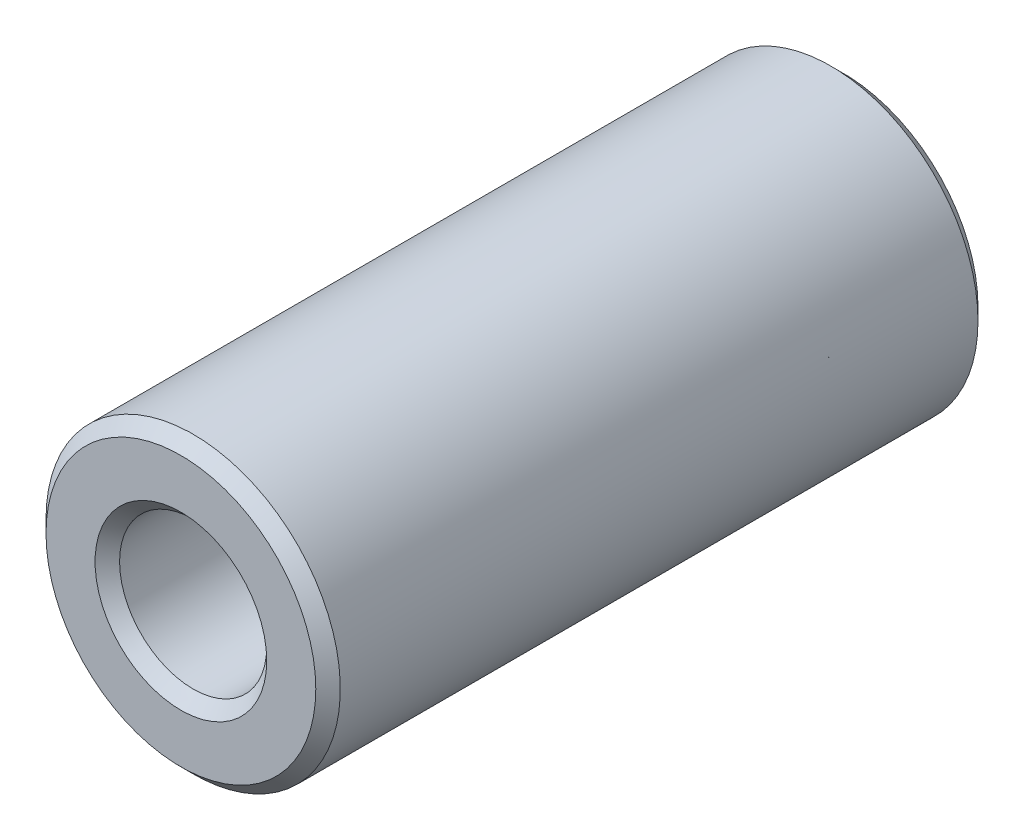
ISO-10303-21;
HEADER;
FILE_DESCRIPTION(('STEP AP214'),'2;1');
FILE_NAME('part.step','',(''),(''),'','','');
FILE_SCHEMA(('AUTOMOTIVE_DESIGN { 1 0 10303 214 1 1 1 1 }'));
ENDSEC;
DATA;
#1=APPLICATION_CONTEXT('core data for automotive mechanical design processes');
#2=APPLICATION_PROTOCOL_DEFINITION('international standard','automotive_design',2000,#1);
#3=PRODUCT_CONTEXT('',#1,'mechanical');
#4=PRODUCT('Part','Part','',(#3));
#5=PRODUCT_RELATED_PRODUCT_CATEGORY('part','',(#4));
#6=PRODUCT_DEFINITION_FORMATION('','',#4);
#7=PRODUCT_DEFINITION_CONTEXT('part definition',#1,'design');
#8=PRODUCT_DEFINITION('design','',#6,#7);
#9=PRODUCT_DEFINITION_SHAPE('','',#8);
#10=(LENGTH_UNIT() NAMED_UNIT(*) SI_UNIT(.MILLI.,.METRE.));
#11=(NAMED_UNIT(*) PLANE_ANGLE_UNIT() SI_UNIT($,.RADIAN.));
#12=(NAMED_UNIT(*) SI_UNIT($,.STERADIAN.) SOLID_ANGLE_UNIT());
#13=UNCERTAINTY_MEASURE_WITH_UNIT(LENGTH_MEASURE(1.E-05),#10,'distance_accuracy_value','');
#14=(GEOMETRIC_REPRESENTATION_CONTEXT(3) GLOBAL_UNCERTAINTY_ASSIGNED_CONTEXT((#13)) GLOBAL_UNIT_ASSIGNED_CONTEXT((#10,
#11,#12)) REPRESENTATION_CONTEXT('',''));
#15=CARTESIAN_POINT('',(0.,0.,0.));
#16=DIRECTION('',(0.,0.,1.));
#17=DIRECTION('',(1.,0.,0.));
#18=AXIS2_PLACEMENT_3D('',#15,#16,#17);
#19=CARTESIAN_POINT('',(0.,0.,27.));
#20=DIRECTION('',(0.,0.,0.999999999999999));
#21=DIRECTION('',(1.,0.,0.));
#22=AXIS2_PLACEMENT_3D('',#19,#20,#21);
#23=PLANE('',#22);
#24=CARTESIAN_POINT('',(0.,0.,27.));
#25=DIRECTION('',(0.,0.,0.999999999999999));
#26=DIRECTION('',(1.,0.,0.));
#27=AXIS2_PLACEMENT_3D('',#24,#25,#26);
#28=CIRCLE('',#27,3.5);
#29=CARTESIAN_POINT('',(3.50000000000001,0.,27.));
#30=VERTEX_POINT('',#29);
#31=EDGE_CURVE('E50',#30,#30,#28,.F.);
#32=ORIENTED_EDGE('',*,*,#31,.T.);
#33=EDGE_LOOP('',(#32));
#34=FACE_BOUND('',#33,.T.);
#35=CARTESIAN_POINT('',(0.,0.,27.));
#36=DIRECTION('',(0.,0.,0.999999999999999));
#37=DIRECTION('',(1.,0.,0.));
#38=AXIS2_PLACEMENT_3D('',#35,#36,#37);
#39=CIRCLE('',#38,5.49999999999999);
#40=CARTESIAN_POINT('',(-5.5,0.,27.));
#41=VERTEX_POINT('',#40);
#42=EDGE_CURVE('E53',#41,#41,#39,.T.);
#43=ORIENTED_EDGE('',*,*,#42,.T.);
#44=EDGE_LOOP('',(#43));
#45=FACE_BOUND('',#44,.T.);
#46=ADVANCED_FACE('F30',(#34,#45),#23,.T.);
#47=CARTESIAN_POINT('',(0.,0.,0.));
#48=DIRECTION('',(0.,0.,0.999999999999999));
#49=DIRECTION('',(1.,0.,0.));
#50=AXIS2_PLACEMENT_3D('',#47,#48,#49);
#51=PLANE('',#50);
#52=CARTESIAN_POINT('',(0.,0.,0.));
#53=DIRECTION('',(0.,0.,0.999999999999999));
#54=DIRECTION('',(1.,0.,0.));
#55=AXIS2_PLACEMENT_3D('',#52,#53,#54);
#56=CIRCLE('',#55,5.5);
#57=CARTESIAN_POINT('',(5.50000000000001,0.,0.));
#58=VERTEX_POINT('',#57);
#59=EDGE_CURVE('E10',#58,#58,#56,.F.);
#60=ORIENTED_EDGE('',*,*,#59,.T.);
#61=EDGE_LOOP('',(#60));
#62=FACE_BOUND('',#61,.T.);
#63=CARTESIAN_POINT('',(0.,0.,0.));
#64=DIRECTION('',(0.,0.,0.999999999999999));
#65=DIRECTION('',(1.,0.,0.));
#66=AXIS2_PLACEMENT_3D('',#63,#64,#65);
#67=CIRCLE('',#66,3.50000000000001);
#68=CARTESIAN_POINT('',(-3.50000000000001,0.,0.));
#69=VERTEX_POINT('',#68);
#70=EDGE_CURVE('E37',#69,#69,#67,.T.);
#71=ORIENTED_EDGE('',*,*,#70,.T.);
#72=EDGE_LOOP('',(#71));
#73=FACE_BOUND('',#72,.T.);
#74=ADVANCED_FACE('F77',(#62,#73),#51,.F.);
#75=CARTESIAN_POINT('',(0.,0.,27.));
#76=DIRECTION('',(0.,0.,-0.999999999999999));
#77=DIRECTION('',(-1.,0.,0.));
#78=AXIS2_PLACEMENT_3D('',#75,#76,#77);
#79=CYLINDRICAL_SURFACE('',#78,6.);
#80=CARTESIAN_POINT('',(0.,0.,26.5));
#81=DIRECTION('',(0.,0.,0.999999999999999));
#82=DIRECTION('',(1.,0.,0.));
#83=AXIS2_PLACEMENT_3D('',#80,#81,#82);
#84=CIRCLE('',#83,6.);
#85=CARTESIAN_POINT('',(-6.00000000000001,0.,26.5));
#86=VERTEX_POINT('',#85);
#87=EDGE_CURVE('E41',#86,#86,#84,.F.);
#88=CARTESIAN_POINT('',(0.,0.,0.500000000000007));
#89=DIRECTION('',(0.,0.,0.999999999999999));
#90=DIRECTION('',(1.,0.,0.));
#91=AXIS2_PLACEMENT_3D('',#88,#89,#90);
#92=CIRCLE('',#91,6.);
#93=CARTESIAN_POINT('',(-6.00000000000001,0.,0.500000000000004));
#94=VERTEX_POINT('',#93);
#95=EDGE_CURVE('E45',#94,#94,#92,.T.);
#96=CARTESIAN_POINT('',(-6.00000000000001,0.,26.5));
#97=CARTESIAN_POINT('',(-6.00000000000001,0.,26.2291666666666));
#98=CARTESIAN_POINT('',(-6.00000000000001,0.,25.9583333333333));
#99=CARTESIAN_POINT('',(-6.00000000000001,0.,25.4166666666666));
#100=CARTESIAN_POINT('',(-6.00000000000001,0.,25.1458333333333));
#101=CARTESIAN_POINT('',(-6.00000000000001,0.,24.6041666666666));
#102=CARTESIAN_POINT('',(-6.00000000000001,0.,24.3333333333333));
#103=CARTESIAN_POINT('',(-6.00000000000001,0.,23.7916666666666));
#104=CARTESIAN_POINT('',(-6.00000000000001,0.,23.5208333333333));
#105=CARTESIAN_POINT('',(-6.00000000000001,0.,22.9791666666666));
#106=CARTESIAN_POINT('',(-6.00000000000001,0.,22.7083333333333));
#107=CARTESIAN_POINT('',(-6.00000000000001,0.,22.1666666666666));
#108=CARTESIAN_POINT('',(-6.00000000000001,0.,21.8958333333333));
#109=CARTESIAN_POINT('',(-6.00000000000001,0.,21.3541666666666));
#110=CARTESIAN_POINT('',(-6.00000000000001,0.,21.0833333333333));
#111=CARTESIAN_POINT('',(-6.00000000000001,0.,20.5416666666666));
#112=CARTESIAN_POINT('',(-6.00000000000001,0.,20.2708333333333));
#113=CARTESIAN_POINT('',(-6.00000000000001,0.,19.7291666666666));
#114=CARTESIAN_POINT('',(-6.00000000000001,0.,19.4583333333333));
#115=CARTESIAN_POINT('',(-6.00000000000001,0.,18.9166666666666));
#116=CARTESIAN_POINT('',(-6.00000000000001,0.,18.6458333333333));
#117=CARTESIAN_POINT('',(-6.00000000000001,0.,18.1041666666666));
#118=CARTESIAN_POINT('',(-6.00000000000001,0.,17.8333333333333));
#119=CARTESIAN_POINT('',(-6.00000000000001,0.,17.2916666666666));
#120=CARTESIAN_POINT('',(-6.00000000000001,0.,17.0208333333333));
#121=CARTESIAN_POINT('',(-6.00000000000001,0.,16.4791666666666));
#122=CARTESIAN_POINT('',(-6.00000000000001,0.,16.2083333333333));
#123=CARTESIAN_POINT('',(-6.00000000000001,0.,15.6666666666666));
#124=CARTESIAN_POINT('',(-6.00000000000001,0.,15.3958333333333));
#125=CARTESIAN_POINT('',(-6.00000000000001,0.,14.8541666666666));
#126=CARTESIAN_POINT('',(-6.00000000000001,0.,14.5833333333333));
#127=CARTESIAN_POINT('',(-6.00000000000001,0.,14.0416666666666));
#128=CARTESIAN_POINT('',(-6.00000000000001,0.,13.7708333333333));
#129=CARTESIAN_POINT('',(-6.00000000000001,0.,13.2291666666666));
#130=CARTESIAN_POINT('',(-6.00000000000001,0.,12.9583333333333));
#131=CARTESIAN_POINT('',(-6.00000000000001,0.,12.4166666666666));
#132=CARTESIAN_POINT('',(-6.00000000000001,0.,12.1458333333333));
#133=CARTESIAN_POINT('',(-6.00000000000001,0.,11.6041666666667));
#134=CARTESIAN_POINT('',(-6.00000000000001,0.,11.3333333333333));
#135=CARTESIAN_POINT('',(-6.00000000000001,0.,10.7916666666666));
#136=CARTESIAN_POINT('',(-6.00000000000001,0.,10.5208333333333));
#137=CARTESIAN_POINT('',(-6.00000000000001,0.,9.97916666666665));
#138=CARTESIAN_POINT('',(-6.00000000000001,0.,9.70833333333332));
#139=CARTESIAN_POINT('',(-6.00000000000001,0.,9.16666666666665));
#140=CARTESIAN_POINT('',(-6.00000000000001,0.,8.89583333333332));
#141=CARTESIAN_POINT('',(-6.00000000000001,0.,8.35416666666666));
#142=CARTESIAN_POINT('',(-6.00000000000001,0.,8.08333333333332));
#143=CARTESIAN_POINT('',(-6.00000000000001,0.,7.54166666666666));
#144=CARTESIAN_POINT('',(-6.00000000000001,0.,7.27083333333332));
#145=CARTESIAN_POINT('',(-6.00000000000001,0.,6.72916666666666));
#146=CARTESIAN_POINT('',(-6.00000000000001,0.,6.45833333333333));
#147=CARTESIAN_POINT('',(-6.00000000000001,0.,5.91666666666666));
#148=CARTESIAN_POINT('',(-6.00000000000001,0.,5.64583333333333));
#149=CARTESIAN_POINT('',(-6.00000000000001,0.,5.10416666666666));
#150=CARTESIAN_POINT('',(-6.00000000000001,0.,4.83333333333333));
#151=CARTESIAN_POINT('',(-6.00000000000001,0.,4.29166666666666));
#152=CARTESIAN_POINT('',(-6.00000000000001,0.,4.02083333333333));
#153=CARTESIAN_POINT('',(-6.00000000000001,0.,3.47916666666666));
#154=CARTESIAN_POINT('',(-6.00000000000001,0.,3.20833333333333));
#155=CARTESIAN_POINT('',(-6.00000000000001,0.,2.66666666666667));
#156=CARTESIAN_POINT('',(-6.00000000000001,0.,2.39583333333333));
#157=CARTESIAN_POINT('',(-6.00000000000001,0.,1.85416666666667));
#158=CARTESIAN_POINT('',(-6.00000000000001,0.,1.58333333333333));
#159=CARTESIAN_POINT('',(-6.00000000000001,0.,1.04166666666667));
#160=CARTESIAN_POINT('',(-6.00000000000001,0.,0.770833333333336));
#161=CARTESIAN_POINT('',(-6.00000000000001,0.,0.500000000000004));
#162=B_SPLINE_CURVE_WITH_KNOTS('',3,(#96,#97,#98,#99,#100,#101,#102,#103,#104,#105,#106,#107,
#108,#109,#110,#111,#112,#113,#114,#115,#116,#117,#118,#119,#120,#121,#122,#123,#124,#125,#126,
#127,#128,#129,#130,#131,#132,#133,#134,#135,#136,#137,#138,#139,#140,#141,#142,#143,#144,#145,
#146,#147,#148,#149,#150,#151,#152,#153,#154,#155,#156,#157,#158,#159,#160,#161),.UNSPECIFIED.,
.F.,.F.,(4,2,2,2,2,2,2,2,2,2,2,2,2,2,2,2,2,2,2,2,2,2,2,2,2,2,2,2,2,2,2,2,4),(0.,
0.812499999999997,1.62499999999999,2.43749999999999,3.24999999999999,4.06249999999999,
4.87499999999999,5.68749999999999,6.49999999999998,7.31249999999998,8.12499999999998,
8.93749999999998,9.74999999999998,10.5625,11.375,12.1875,13.,13.8125,14.625,15.4375,16.25,
17.0625,17.875,18.6875,19.5,20.3125,21.125,21.9375,22.75,23.5625,24.375,25.1875,
25.9999999999999),.UNSPECIFIED.);
#163=EDGE_CURVE('BSEAM32',#86,#94,#162,.T.);
#164=ORIENTED_EDGE('',*,*,#87,.T.);
#165=ORIENTED_EDGE('',*,*,#95,.T.);
#166=ORIENTED_EDGE('',*,*,#163,.T.);
#167=ORIENTED_EDGE('',*,*,#163,.F.);
#168=EDGE_LOOP('',(#164,#166,#165,#167));
#169=FACE_BOUND('',#168,.T.);
#170=ADVANCED_FACE('F32',(#169),#79,.T.);
#171=CARTESIAN_POINT('',(0.,0.,27.));
#172=DIRECTION('',(0.,0.,-0.999999999999999));
#173=DIRECTION('',(-1.,0.,0.));
#174=AXIS2_PLACEMENT_3D('',#171,#172,#173);
#175=CYLINDRICAL_SURFACE('',#174,3.);
#176=CARTESIAN_POINT('',(0.,0.,26.5));
#177=DIRECTION('',(0.,0.,0.999999999999999));
#178=DIRECTION('',(1.,0.,0.));
#179=AXIS2_PLACEMENT_3D('',#176,#177,#178);
#180=CIRCLE('',#179,3.);
#181=CARTESIAN_POINT('',(-3.,0.,26.5));
#182=VERTEX_POINT('',#181);
#183=EDGE_CURVE('E56',#182,#182,#180,.T.);
#184=CARTESIAN_POINT('',(0.,0.,0.5));
#185=DIRECTION('',(0.,0.,0.999999999999999));
#186=DIRECTION('',(1.,0.,0.));
#187=AXIS2_PLACEMENT_3D('',#184,#185,#186);
#188=CIRCLE('',#187,3.);
#189=CARTESIAN_POINT('',(-3.,0.,0.499999999999997));
#190=VERTEX_POINT('',#189);
#191=EDGE_CURVE('E59',#190,#190,#188,.F.);
#192=CARTESIAN_POINT('',(-3.,0.,26.5));
#193=CARTESIAN_POINT('',(-3.,0.,26.2291666666666));
#194=CARTESIAN_POINT('',(-3.,0.,25.9583333333333));
#195=CARTESIAN_POINT('',(-3.,0.,25.4166666666666));
#196=CARTESIAN_POINT('',(-3.,0.,25.1458333333333));
#197=CARTESIAN_POINT('',(-3.,0.,24.6041666666666));
#198=CARTESIAN_POINT('',(-3.,0.,24.3333333333333));
#199=CARTESIAN_POINT('',(-3.,0.,23.7916666666666));
#200=CARTESIAN_POINT('',(-3.,0.,23.5208333333333));
#201=CARTESIAN_POINT('',(-3.,0.,22.9791666666666));
#202=CARTESIAN_POINT('',(-3.,0.,22.7083333333333));
#203=CARTESIAN_POINT('',(-3.,0.,22.1666666666666));
#204=CARTESIAN_POINT('',(-3.,0.,21.8958333333333));
#205=CARTESIAN_POINT('',(-3.,0.,21.3541666666666));
#206=CARTESIAN_POINT('',(-3.,0.,21.0833333333333));
#207=CARTESIAN_POINT('',(-3.,0.,20.5416666666666));
#208=CARTESIAN_POINT('',(-3.,0.,20.2708333333333));
#209=CARTESIAN_POINT('',(-3.,0.,19.7291666666666));
#210=CARTESIAN_POINT('',(-3.,0.,19.4583333333333));
#211=CARTESIAN_POINT('',(-3.,0.,18.9166666666666));
#212=CARTESIAN_POINT('',(-3.,0.,18.6458333333333));
#213=CARTESIAN_POINT('',(-3.,0.,18.1041666666666));
#214=CARTESIAN_POINT('',(-3.,0.,17.8333333333333));
#215=CARTESIAN_POINT('',(-3.,0.,17.2916666666666));
#216=CARTESIAN_POINT('',(-3.,0.,17.0208333333333));
#217=CARTESIAN_POINT('',(-3.,0.,16.4791666666666));
#218=CARTESIAN_POINT('',(-3.,0.,16.2083333333333));
#219=CARTESIAN_POINT('',(-3.,0.,15.6666666666666));
#220=CARTESIAN_POINT('',(-3.,0.,15.3958333333333));
#221=CARTESIAN_POINT('',(-3.,0.,14.8541666666666));
#222=CARTESIAN_POINT('',(-3.,0.,14.5833333333333));
#223=CARTESIAN_POINT('',(-3.,0.,14.0416666666666));
#224=CARTESIAN_POINT('',(-3.,0.,13.7708333333333));
#225=CARTESIAN_POINT('',(-3.,0.,13.2291666666666));
#226=CARTESIAN_POINT('',(-3.,0.,12.9583333333333));
#227=CARTESIAN_POINT('',(-3.,0.,12.4166666666666));
#228=CARTESIAN_POINT('',(-3.,0.,12.1458333333333));
#229=CARTESIAN_POINT('',(-3.,0.,11.6041666666666));
#230=CARTESIAN_POINT('',(-3.,0.,11.3333333333333));
#231=CARTESIAN_POINT('',(-3.,0.,10.7916666666666));
#232=CARTESIAN_POINT('',(-3.,0.,10.5208333333333));
#233=CARTESIAN_POINT('',(-3.,0.,9.97916666666664));
#234=CARTESIAN_POINT('',(-3.,0.,9.70833333333331));
#235=CARTESIAN_POINT('',(-3.,0.,9.16666666666665));
#236=CARTESIAN_POINT('',(-3.,0.,8.89583333333332));
#237=CARTESIAN_POINT('',(-3.,0.,8.35416666666665));
#238=CARTESIAN_POINT('',(-3.,0.,8.08333333333332));
#239=CARTESIAN_POINT('',(-3.,0.,7.54166666666665));
#240=CARTESIAN_POINT('',(-3.,0.,7.27083333333332));
#241=CARTESIAN_POINT('',(-3.,0.,6.72916666666665));
#242=CARTESIAN_POINT('',(-3.,0.,6.45833333333332));
#243=CARTESIAN_POINT('',(-3.,0.,5.91666666666665));
#244=CARTESIAN_POINT('',(-3.,0.,5.64583333333332));
#245=CARTESIAN_POINT('',(-3.,0.,5.10416666666666));
#246=CARTESIAN_POINT('',(-3.,0.,4.83333333333332));
#247=CARTESIAN_POINT('',(-3.,0.,4.29166666666666));
#248=CARTESIAN_POINT('',(-3.,0.,4.02083333333332));
#249=CARTESIAN_POINT('',(-3.,0.,3.47916666666666));
#250=CARTESIAN_POINT('',(-3.,0.,3.20833333333333));
#251=CARTESIAN_POINT('',(-3.,0.,2.66666666666666));
#252=CARTESIAN_POINT('',(-3.,0.,2.39583333333333));
#253=CARTESIAN_POINT('',(-3.,0.,1.85416666666666));
#254=CARTESIAN_POINT('',(-3.,0.,1.58333333333333));
#255=CARTESIAN_POINT('',(-3.,0.,1.04166666666666));
#256=CARTESIAN_POINT('',(-3.,0.,0.770833333333331));
#257=CARTESIAN_POINT('',(-3.,0.,0.499999999999997));
#258=B_SPLINE_CURVE_WITH_KNOTS('',3,(#192,#193,#194,#195,#196,#197,#198,#199,#200,#201,#202,
#203,#204,#205,#206,#207,#208,#209,#210,#211,#212,#213,#214,#215,#216,#217,#218,#219,#220,#221,
#222,#223,#224,#225,#226,#227,#228,#229,#230,#231,#232,#233,#234,#235,#236,#237,#238,#239,#240,
#241,#242,#243,#244,#245,#246,#247,#248,#249,#250,#251,#252,#253,#254,#255,#256,#257),
.UNSPECIFIED.,.F.,.F.,(4,2,2,2,2,2,2,2,2,2,2,2,2,2,2,2,2,2,2,2,2,2,2,2,2,2,2,2,2,2,2,2,4),(0.,
0.812499999999997,1.62499999999999,2.4375,3.24999999999999,4.06249999999999,4.87499999999999,
5.68749999999999,6.49999999999999,7.31249999999999,8.12499999999998,8.93749999999998,
9.74999999999998,10.5625,11.375,12.1875,13.,13.8125,14.625,15.4375,16.25,17.0625,17.875,18.6875,
19.5,20.3125,21.125,21.9375,22.75,23.5625,24.375,25.1875,26.),.UNSPECIFIED.);
#259=EDGE_CURVE('BSEAM63',#182,#190,#258,.T.);
#260=ORIENTED_EDGE('',*,*,#183,.T.);
#261=ORIENTED_EDGE('',*,*,#191,.T.);
#262=ORIENTED_EDGE('',*,*,#259,.T.);
#263=ORIENTED_EDGE('',*,*,#259,.F.);
#264=EDGE_LOOP('',(#260,#262,#261,#263));
#265=FACE_BOUND('',#264,.T.);
#266=ADVANCED_FACE('F63',(#265),#175,.F.);
#267=CARTESIAN_POINT('',(0.,0.,26.5));
#268=DIRECTION('',(0.,0.,0.999999999999999));
#269=DIRECTION('',(1.,0.,0.));
#270=AXIS2_PLACEMENT_3D('',#267,#268,#269);
#271=CONICAL_SURFACE('',#270,3.,0.785398163397445);
#272=ORIENTED_EDGE('',*,*,#31,.F.);
#273=EDGE_LOOP('',(#272));
#274=FACE_BOUND('',#273,.T.);
#275=ORIENTED_EDGE('',*,*,#183,.F.);
#276=EDGE_LOOP('',(#275));
#277=FACE_BOUND('',#276,.T.);
#278=ADVANCED_FACE('F87',(#274,#277),#271,.F.);
#279=CARTESIAN_POINT('',(0.,0.,27.));
#280=DIRECTION('',(0.,0.,-0.999999999999999));
#281=DIRECTION('',(-1.,0.,0.));
#282=AXIS2_PLACEMENT_3D('',#279,#280,#281);
#283=CONICAL_SURFACE('',#282,5.49999999999999,0.785398163397453);
#284=CARTESIAN_POINT('',(-6.00000000000002,0.,26.5));
#285=CARTESIAN_POINT('',(-5.99479166666669,0.,26.5052083333333));
#286=CARTESIAN_POINT('',(-5.98958333333336,0.,26.5104166666666));
#287=CARTESIAN_POINT('',(-5.97916666666669,0.,26.5208333333333));
#288=CARTESIAN_POINT('',(-5.97395833333336,0.,26.5260416666666));
#289=CARTESIAN_POINT('',(-5.96354166666669,0.,26.5364583333333));
#290=CARTESIAN_POINT('',(-5.95833333333335,0.,26.5416666666666));
#291=CARTESIAN_POINT('',(-5.94791666666669,0.,26.5520833333333));
#292=CARTESIAN_POINT('',(-5.94270833333335,0.,26.5572916666666));
#293=CARTESIAN_POINT('',(-5.93229166666669,0.,26.5677083333333));
#294=CARTESIAN_POINT('',(-5.92708333333335,0.,26.5729166666666));
#295=CARTESIAN_POINT('',(-5.91666666666669,0.,26.5833333333333));
#296=CARTESIAN_POINT('',(-5.91145833333335,0.,26.5885416666666));
#297=CARTESIAN_POINT('',(-5.90104166666669,0.,26.5989583333333));
#298=CARTESIAN_POINT('',(-5.89583333333335,0.,26.6041666666666));
#299=CARTESIAN_POINT('',(-5.88541666666669,0.,26.6145833333333));
#300=CARTESIAN_POINT('',(-5.88020833333335,0.,26.6197916666666));
#301=CARTESIAN_POINT('',(-5.86979166666668,0.,26.6302083333333));
#302=CARTESIAN_POINT('',(-5.86458333333335,0.,26.6354166666666));
#303=CARTESIAN_POINT('',(-5.85416666666668,0.,26.6458333333333));
#304=CARTESIAN_POINT('',(-5.84895833333335,0.,26.6510416666666));
#305=CARTESIAN_POINT('',(-5.83854166666668,0.,26.6614583333333));
#306=CARTESIAN_POINT('',(-5.83333333333335,0.,26.6666666666666));
#307=CARTESIAN_POINT('',(-5.82291666666668,0.,26.6770833333333));
#308=CARTESIAN_POINT('',(-5.81770833333335,0.,26.6822916666666));
#309=CARTESIAN_POINT('',(-5.80729166666668,0.,26.6927083333333));
#310=CARTESIAN_POINT('',(-5.80208333333335,0.,26.6979166666666));
#311=CARTESIAN_POINT('',(-5.79166666666668,0.,26.7083333333333));
#312=CARTESIAN_POINT('',(-5.78645833333335,0.,26.7135416666666));
#313=CARTESIAN_POINT('',(-5.77604166666668,0.,26.7239583333333));
#314=CARTESIAN_POINT('',(-5.77083333333335,0.,26.7291666666666));
#315=CARTESIAN_POINT('',(-5.76041666666668,0.,26.7395833333333));
#316=CARTESIAN_POINT('',(-5.75520833333335,0.,26.7447916666666));
#317=CARTESIAN_POINT('',(-5.74479166666668,0.,26.7552083333333));
#318=CARTESIAN_POINT('',(-5.73958333333335,0.,26.7604166666666));
#319=CARTESIAN_POINT('',(-5.72916666666668,0.,26.7708333333333));
#320=CARTESIAN_POINT('',(-5.72395833333335,0.,26.7760416666666));
#321=CARTESIAN_POINT('',(-5.71354166666668,0.,26.7864583333333));
#322=CARTESIAN_POINT('',(-5.70833333333334,0.,26.7916666666666));
#323=CARTESIAN_POINT('',(-5.69791666666668,0.,26.8020833333333));
#324=CARTESIAN_POINT('',(-5.69270833333334,0.,26.8072916666666));
#325=CARTESIAN_POINT('',(-5.68229166666668,0.,26.8177083333333));
#326=CARTESIAN_POINT('',(-5.67708333333334,0.,26.8229166666666));
#327=CARTESIAN_POINT('',(-5.66666666666668,0.,26.8333333333333));
#328=CARTESIAN_POINT('',(-5.66145833333334,0.,26.8385416666666));
#329=CARTESIAN_POINT('',(-5.65104166666668,0.,26.8489583333333));
#330=CARTESIAN_POINT('',(-5.64583333333334,0.,26.8541666666666));
#331=CARTESIAN_POINT('',(-5.63541666666668,0.,26.8645833333333));
#332=CARTESIAN_POINT('',(-5.63020833333334,0.,26.8697916666666));
#333=CARTESIAN_POINT('',(-5.61979166666667,0.,26.8802083333333));
#334=CARTESIAN_POINT('',(-5.61458333333334,0.,26.8854166666666));
#335=CARTESIAN_POINT('',(-5.60416666666667,0.,26.8958333333333));
#336=CARTESIAN_POINT('',(-5.59895833333334,0.,26.9010416666666));
#337=CARTESIAN_POINT('',(-5.58854166666667,0.,26.9114583333333));
#338=CARTESIAN_POINT('',(-5.58333333333334,0.,26.9166666666666));
#339=CARTESIAN_POINT('',(-5.57291666666667,0.,26.9270833333333));
#340=CARTESIAN_POINT('',(-5.56770833333334,0.,26.9322916666666));
#341=CARTESIAN_POINT('',(-5.55729166666667,0.,26.9427083333333));
#342=CARTESIAN_POINT('',(-5.55208333333334,0.,26.9479166666666));
#343=CARTESIAN_POINT('',(-5.54166666666667,0.,26.9583333333333));
#344=CARTESIAN_POINT('',(-5.53645833333334,0.,26.9635416666666));
#345=CARTESIAN_POINT('',(-5.52604166666667,0.,26.9739583333333));
#346=CARTESIAN_POINT('',(-5.52083333333334,0.,26.9791666666666));
#347=CARTESIAN_POINT('',(-5.51041666666667,0.,26.9895833333333));
#348=CARTESIAN_POINT('',(-5.50520833333334,0.,26.9947916666666));
#349=CARTESIAN_POINT('',(-5.5,0.,27.));
#350=B_SPLINE_CURVE_WITH_KNOTS('',3,(#284,#285,#286,#287,#288,#289,#290,#291,#292,#293,#294,
#295,#296,#297,#298,#299,#300,#301,#302,#303,#304,#305,#306,#307,#308,#309,#310,#311,#312,#313,
#314,#315,#316,#317,#318,#319,#320,#321,#322,#323,#324,#325,#326,#327,#328,#329,#330,#331,#332,
#333,#334,#335,#336,#337,#338,#339,#340,#341,#342,#343,#344,#345,#346,#347,#348,#349),
.UNSPECIFIED.,.F.,.F.,(4,2,2,2,2,2,2,2,2,2,2,2,2,2,2,2,2,2,2,2,2,2,2,2,2,2,2,2,2,2,2,2,4),(0.,
0.0220970869120815,0.0441941738241629,0.066291260736242,0.0883883476483228,0.110485434560404,
0.132582521472483,0.154679608384564,0.176776695296643,0.198873782208725,0.220970869120806,
0.243067956032885,0.265165042944966,0.287262129857048,0.309359216769126,0.331456303681207,
0.353553390593286,0.375650477505367,0.397747564417449,0.419844651329528,0.441941738241609,
0.46403882515369,0.486135912065769,0.50823299897785,0.530330085889929,0.55242717280201,
0.574524259714092,0.596621346626171,0.618718433538252,0.640815520450333,0.662912607362413,
0.685009694274494,0.707106781186575),.UNSPECIFIED.);
#351=EDGE_CURVE('BSEAM73',#86,#41,#350,.T.);
#352=ORIENTED_EDGE('',*,*,#87,.F.);
#353=ORIENTED_EDGE('',*,*,#42,.F.);
#354=ORIENTED_EDGE('',*,*,#351,.T.);
#355=ORIENTED_EDGE('',*,*,#351,.F.);
#356=EDGE_LOOP('',(#352,#354,#353,#355));
#357=FACE_BOUND('',#356,.T.);
#358=ADVANCED_FACE('F73',(#357),#283,.T.);
#359=CARTESIAN_POINT('',(0.,0.,0.500000000000007));
#360=DIRECTION('',(0.,0.,0.999999999999999));
#361=DIRECTION('',(1.,0.,0.));
#362=AXIS2_PLACEMENT_3D('',#359,#360,#361);
#363=CONICAL_SURFACE('',#362,6.,0.785398163397445);
#364=ORIENTED_EDGE('',*,*,#59,.F.);
#365=EDGE_LOOP('',(#364));
#366=FACE_BOUND('',#365,.T.);
#367=ORIENTED_EDGE('',*,*,#95,.F.);
#368=EDGE_LOOP('',(#367));
#369=FACE_BOUND('',#368,.T.);
#370=ADVANCED_FACE('F68',(#366,#369),#363,.T.);
#371=CARTESIAN_POINT('',(0.,0.,0.));
#372=DIRECTION('',(0.,0.,-0.999999999999999));
#373=DIRECTION('',(-1.,0.,0.));
#374=AXIS2_PLACEMENT_3D('',#371,#372,#373);
#375=CONICAL_SURFACE('',#374,3.50000000000001,0.785398163397453);
#376=CARTESIAN_POINT('',(-3.00000000000001,0.,0.5));
#377=CARTESIAN_POINT('',(-3.00520833333334,0.,0.494791666666667));
#378=CARTESIAN_POINT('',(-3.01041666666667,0.,0.489583333333334));
#379=CARTESIAN_POINT('',(-3.02083333333334,0.,0.479166666666667));
#380=CARTESIAN_POINT('',(-3.02604166666667,0.,0.473958333333334));
#381=CARTESIAN_POINT('',(-3.03645833333334,0.,0.463541666666667));
#382=CARTESIAN_POINT('',(-3.04166666666667,0.,0.458333333333334));
#383=CARTESIAN_POINT('',(-3.05208333333334,0.,0.447916666666667));
#384=CARTESIAN_POINT('',(-3.05729166666667,0.,0.442708333333334));
#385=CARTESIAN_POINT('',(-3.06770833333334,0.,0.432291666666667));
#386=CARTESIAN_POINT('',(-3.07291666666667,0.,0.427083333333334));
#387=CARTESIAN_POINT('',(-3.08333333333334,0.,0.416666666666667));
#388=CARTESIAN_POINT('',(-3.08854166666668,0.,0.411458333333334));
#389=CARTESIAN_POINT('',(-3.09895833333334,0.,0.401041666666667));
#390=CARTESIAN_POINT('',(-3.10416666666668,0.,0.395833333333334));
#391=CARTESIAN_POINT('',(-3.11458333333334,0.,0.385416666666667));
#392=CARTESIAN_POINT('',(-3.11979166666668,0.,0.380208333333334));
#393=CARTESIAN_POINT('',(-3.13020833333334,0.,0.369791666666667));
#394=CARTESIAN_POINT('',(-3.13541666666668,0.,0.364583333333334));
#395=CARTESIAN_POINT('',(-3.14583333333334,0.,0.354166666666667));
#396=CARTESIAN_POINT('',(-3.15104166666668,0.,0.348958333333334));
#397=CARTESIAN_POINT('',(-3.16145833333334,0.,0.338541666666667));
#398=CARTESIAN_POINT('',(-3.16666666666668,0.,0.333333333333333));
#399=CARTESIAN_POINT('',(-3.17708333333334,0.,0.322916666666667));
#400=CARTESIAN_POINT('',(-3.18229166666668,0.,0.317708333333334));
#401=CARTESIAN_POINT('',(-3.19270833333334,0.,0.307291666666667));
#402=CARTESIAN_POINT('',(-3.19791666666668,0.,0.302083333333333));
#403=CARTESIAN_POINT('',(-3.20833333333334,0.,0.291666666666667));
#404=CARTESIAN_POINT('',(-3.21354166666668,0.,0.286458333333334));
#405=CARTESIAN_POINT('',(-3.22395833333334,0.,0.276041666666667));
#406=CARTESIAN_POINT('',(-3.22916666666668,0.,0.270833333333334));
#407=CARTESIAN_POINT('',(-3.23958333333334,0.,0.260416666666667));
#408=CARTESIAN_POINT('',(-3.24479166666668,0.,0.255208333333333));
#409=CARTESIAN_POINT('',(-3.25520833333334,0.,0.244791666666667));
#410=CARTESIAN_POINT('',(-3.26041666666668,0.,0.239583333333334));
#411=CARTESIAN_POINT('',(-3.27083333333334,0.,0.229166666666667));
#412=CARTESIAN_POINT('',(-3.27604166666668,0.,0.223958333333334));
#413=CARTESIAN_POINT('',(-3.28645833333334,0.,0.213541666666667));
#414=CARTESIAN_POINT('',(-3.29166666666668,0.,0.208333333333333));
#415=CARTESIAN_POINT('',(-3.30208333333334,0.,0.197916666666667));
#416=CARTESIAN_POINT('',(-3.30729166666668,0.,0.192708333333334));
#417=CARTESIAN_POINT('',(-3.31770833333335,0.,0.182291666666667));
#418=CARTESIAN_POINT('',(-3.32291666666668,0.,0.177083333333333));
#419=CARTESIAN_POINT('',(-3.33333333333335,0.,0.166666666666667));
#420=CARTESIAN_POINT('',(-3.33854166666668,0.,0.161458333333333));
#421=CARTESIAN_POINT('',(-3.34895833333335,0.,0.151041666666667));
#422=CARTESIAN_POINT('',(-3.35416666666668,0.,0.145833333333333));
#423=CARTESIAN_POINT('',(-3.36458333333335,0.,0.135416666666667));
#424=CARTESIAN_POINT('',(-3.36979166666668,0.,0.130208333333333));
#425=CARTESIAN_POINT('',(-3.38020833333335,0.,0.119791666666667));
#426=CARTESIAN_POINT('',(-3.38541666666668,0.,0.114583333333333));
#427=CARTESIAN_POINT('',(-3.39583333333335,0.,0.104166666666667));
#428=CARTESIAN_POINT('',(-3.40104166666668,0.,0.0989583333333334));
#429=CARTESIAN_POINT('',(-3.41145833333335,0.,0.0885416666666667));
#430=CARTESIAN_POINT('',(-3.41666666666668,0.,0.0833333333333334));
#431=CARTESIAN_POINT('',(-3.42708333333335,0.,0.0729166666666667));
#432=CARTESIAN_POINT('',(-3.43229166666668,0.,0.0677083333333334));
#433=CARTESIAN_POINT('',(-3.44270833333335,0.,0.0572916666666667));
#434=CARTESIAN_POINT('',(-3.44791666666668,0.,0.0520833333333334));
#435=CARTESIAN_POINT('',(-3.45833333333335,0.,0.0416666666666667));
#436=CARTESIAN_POINT('',(-3.46354166666668,0.,0.0364583333333333));
#437=CARTESIAN_POINT('',(-3.47395833333335,0.,0.0260416666666666));
#438=CARTESIAN_POINT('',(-3.47916666666668,0.,0.0208333333333333));
#439=CARTESIAN_POINT('',(-3.48958333333335,0.,0.0104166666666667));
#440=CARTESIAN_POINT('',(-3.49479166666668,0.,0.00520833333333343));
#441=CARTESIAN_POINT('',(-3.50000000000001,0.,0.));
#442=B_SPLINE_CURVE_WITH_KNOTS('',3,(#376,#377,#378,#379,#380,#381,#382,#383,#384,#385,#386,
#387,#388,#389,#390,#391,#392,#393,#394,#395,#396,#397,#398,#399,#400,#401,#402,#403,#404,#405,
#406,#407,#408,#409,#410,#411,#412,#413,#414,#415,#416,#417,#418,#419,#420,#421,#422,#423,#424,
#425,#426,#427,#428,#429,#430,#431,#432,#433,#434,#435,#436,#437,#438,#439,#440,#441),
.UNSPECIFIED.,.F.,.F.,(4,2,2,2,2,2,2,2,2,2,2,2,2,2,2,2,2,2,2,2,2,2,2,2,2,2,2,2,2,2,2,2,4),(0.,
0.0220970869120799,0.0441941738241596,0.0662912607362395,0.0883883476483191,0.110485434560399,
0.132582521472479,0.154679608384559,0.176776695296638,0.198873782208718,0.220970869120798,
0.243067956032877,0.265165042944957,0.287262129857037,0.309359216769117,0.331456303681197,
0.353553390593276,0.375650477505356,0.397747564417436,0.419844651329515,0.441941738241595,
0.464038825153675,0.486135912065755,0.508232998977835,0.530330085889914,0.552427172801994,
0.574524259714074,0.596621346626154,0.618718433538234,0.640815520450313,0.662912607362393,
0.685009694274473,0.707106781186553),.UNSPECIFIED.);
#443=EDGE_CURVE('BSEAM65',#190,#69,#442,.T.);
#444=ORIENTED_EDGE('',*,*,#191,.F.);
#445=ORIENTED_EDGE('',*,*,#70,.F.);
#446=ORIENTED_EDGE('',*,*,#443,.T.);
#447=ORIENTED_EDGE('',*,*,#443,.F.);
#448=EDGE_LOOP('',(#444,#446,#445,#447));
#449=FACE_BOUND('',#448,.T.);
#450=ADVANCED_FACE('F65',(#449),#375,.F.);
#451=CLOSED_SHELL('',(#46,#74,#170,#266,#278,#358,#370,#450));
#452=MANIFOLD_SOLID_BREP('B2',#451);
#453=ADVANCED_BREP_SHAPE_REPRESENTATION('',(#18,#452),#14);
#454=SHAPE_DEFINITION_REPRESENTATION(#9,#453);
ENDSEC;
END-ISO-10303-21;
